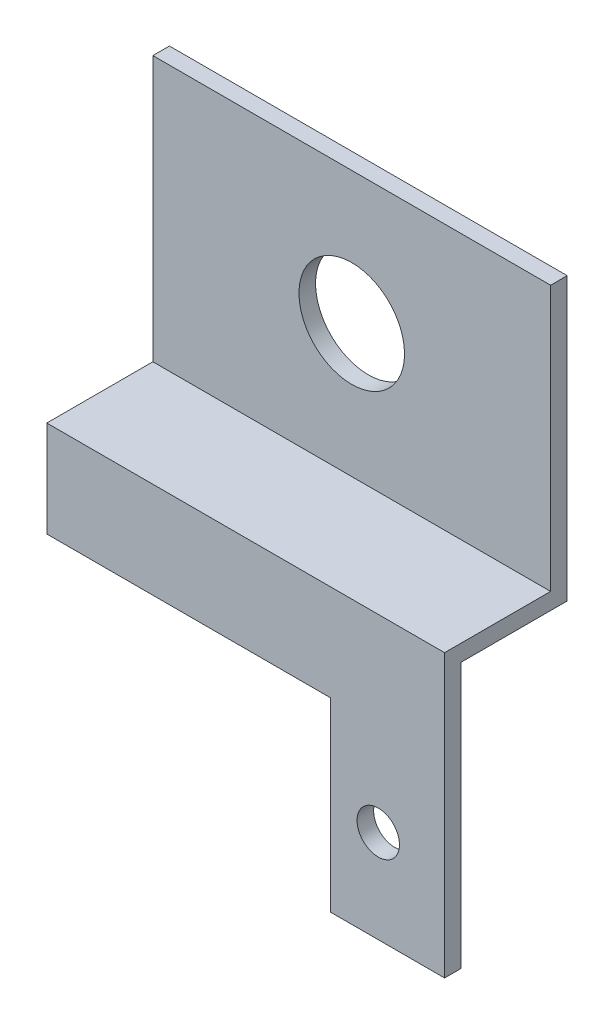
ISO-10303-21;
HEADER;
FILE_DESCRIPTION(('STEP AP214'),'2;1');
FILE_NAME('part.step','',(''),(''),'','','');
FILE_SCHEMA(('AUTOMOTIVE_DESIGN { 1 0 10303 214 1 1 1 1 }'));
ENDSEC;
DATA;
#1=APPLICATION_CONTEXT('core data for automotive mechanical design processes');
#2=APPLICATION_PROTOCOL_DEFINITION('international standard','automotive_design',2000,#1);
#3=PRODUCT_CONTEXT('',#1,'mechanical');
#4=PRODUCT('Part','Part','',(#3));
#5=PRODUCT_RELATED_PRODUCT_CATEGORY('part','',(#4));
#6=PRODUCT_DEFINITION_FORMATION('','',#4);
#7=PRODUCT_DEFINITION_CONTEXT('part definition',#1,'design');
#8=PRODUCT_DEFINITION('design','',#6,#7);
#9=PRODUCT_DEFINITION_SHAPE('','',#8);
#10=(LENGTH_UNIT() NAMED_UNIT(*) SI_UNIT(.MILLI.,.METRE.));
#11=(NAMED_UNIT(*) PLANE_ANGLE_UNIT() SI_UNIT($,.RADIAN.));
#12=(NAMED_UNIT(*) SI_UNIT($,.STERADIAN.) SOLID_ANGLE_UNIT());
#13=UNCERTAINTY_MEASURE_WITH_UNIT(LENGTH_MEASURE(1.E-05),#10,'distance_accuracy_value','');
#14=(GEOMETRIC_REPRESENTATION_CONTEXT(3) GLOBAL_UNCERTAINTY_ASSIGNED_CONTEXT((#13)) GLOBAL_UNIT_ASSIGNED_CONTEXT((#10,
#11,#12)) REPRESENTATION_CONTEXT('',''));
#15=CARTESIAN_POINT('',(0.,0.,0.));
#16=DIRECTION('',(0.,0.,1.));
#17=DIRECTION('',(1.,0.,0.));
#18=AXIS2_PLACEMENT_3D('',#15,#16,#17);
#19=CARTESIAN_POINT('',(19.05,-13.49375,14.1865840906963));
#20=DIRECTION('',(0.,1.,0.));
#21=DIRECTION('',(0.,0.,1.));
#22=AXIS2_PLACEMENT_3D('',#19,#20,#21);
#23=PLANE('',#22);
#24=DIRECTION('',(0.,0.,-1.));
#25=VECTOR('',#24,1.);
#26=CARTESIAN_POINT('',(13.589,-13.49375,14.9803340906964));
#27=LINE('',#26,#25);
#28=CARTESIAN_POINT('',(13.589,-13.49375,14.9803340906964));
#29=VERTEX_POINT('',#28);
#30=CARTESIAN_POINT('',(13.589,-13.49375,14.1865840906963));
#31=VERTEX_POINT('',#30);
#32=EDGE_CURVE('E193',#29,#31,#27,.T.);
#33=ORIENTED_EDGE('',*,*,#32,.T.);
#34=DIRECTION('',(-1.,0.,0.));
#35=VECTOR('',#34,1.);
#36=CARTESIAN_POINT('',(19.05,-13.49375,14.1865840906963));
#37=LINE('',#36,#35);
#38=CARTESIAN_POINT('',(19.05,-13.49375,14.1865840906963));
#39=VERTEX_POINT('',#38);
#40=EDGE_CURVE('E11',#39,#31,#37,.T.);
#41=ORIENTED_EDGE('',*,*,#40,.F.);
#42=DIRECTION('',(0.,0.,-1.));
#43=VECTOR('',#42,1.);
#44=CARTESIAN_POINT('',(19.05,-13.49375,14.1865840906963));
#45=LINE('',#44,#43);
#46=CARTESIAN_POINT('',(19.05,-13.49375,14.9803340906963));
#47=VERTEX_POINT('',#46);
#48=EDGE_CURVE('E146',#47,#39,#45,.T.);
#49=ORIENTED_EDGE('',*,*,#48,.F.);
#50=DIRECTION('',(-1.,0.,0.));
#51=VECTOR('',#50,1.);
#52=CARTESIAN_POINT('',(19.05,-13.49375,14.9803340906963));
#53=LINE('',#52,#51);
#54=EDGE_CURVE('E128',#47,#29,#53,.T.);
#55=ORIENTED_EDGE('',*,*,#54,.T.);
#56=EDGE_LOOP('',(#33,#41,#49,#55));
#57=FACE_BOUND('',#56,.T.);
#58=ADVANCED_FACE('F33',(#57),#23,.F.);
#59=CARTESIAN_POINT('',(19.05,-0.793750000000002,14.1865840906963));
#60=DIRECTION('',(0.,0.,1.));
#61=DIRECTION('',(0.,-1.,0.));
#62=AXIS2_PLACEMENT_3D('',#59,#60,#61);
#63=PLANE('',#62);
#64=CARTESIAN_POINT('',(15.875,-9.04875,14.1865840906963));
#65=DIRECTION('',(0.,0.,-1.));
#66=DIRECTION('',(0.,1.,0.));
#67=AXIS2_PLACEMENT_3D('',#64,#65,#66);
#68=CIRCLE('',#67,1.016);
#69=CARTESIAN_POINT('',(15.875,-8.03275,14.1865840906963));
#70=VERTEX_POINT('',#69);
#71=EDGE_CURVE('E187',#70,#70,#68,.T.);
#72=ORIENTED_EDGE('',*,*,#71,.F.);
#73=EDGE_LOOP('',(#72));
#74=FACE_BOUND('',#73,.T.);
#75=DIRECTION('',(0.,1.,0.));
#76=VECTOR('',#75,1.);
#77=CARTESIAN_POINT('',(13.589,0.,14.1865840906963));
#78=LINE('',#77,#76);
#79=CARTESIAN_POINT('',(13.589,-4.60375,14.1865840906963));
#80=VERTEX_POINT('',#79);
#81=EDGE_CURVE('E204',#31,#80,#78,.T.);
#82=ORIENTED_EDGE('',*,*,#81,.T.);
#83=DIRECTION('',(1.,0.,0.));
#84=VECTOR('',#83,1.);
#85=CARTESIAN_POINT('',(0.,-4.60375,14.1865840906963));
#86=LINE('',#85,#84);
#87=CARTESIAN_POINT('',(0.,-4.60375,14.1865840906963));
#88=VERTEX_POINT('',#87);
#89=EDGE_CURVE('E200',#88,#80,#86,.T.);
#90=ORIENTED_EDGE('',*,*,#89,.F.);
#91=DIRECTION('',(0.,1.,0.));
#92=VECTOR('',#91,1.);
#93=CARTESIAN_POINT('',(0.,-0.793750000000002,14.1865840906963));
#94=LINE('',#93,#92);
#95=CARTESIAN_POINT('',(0.,-0.793750000000002,14.1865840906963));
#96=VERTEX_POINT('',#95);
#97=EDGE_CURVE('E132',#88,#96,#94,.T.);
#98=ORIENTED_EDGE('',*,*,#97,.T.);
#99=DIRECTION('',(-1.,0.,0.));
#100=VECTOR('',#99,1.);
#101=CARTESIAN_POINT('',(19.05,-0.793750000000002,14.1865840906963));
#102=LINE('',#101,#100);
#103=CARTESIAN_POINT('',(19.05,-0.793750000000002,14.1865840906963));
#104=VERTEX_POINT('',#103);
#105=EDGE_CURVE('E40',#104,#96,#102,.T.);
#106=ORIENTED_EDGE('',*,*,#105,.F.);
#107=DIRECTION('',(0.,1.,0.));
#108=VECTOR('',#107,1.);
#109=CARTESIAN_POINT('',(19.05,-0.793750000000002,14.1865840906963));
#110=LINE('',#109,#108);
#111=EDGE_CURVE('E92',#39,#104,#110,.T.);
#112=ORIENTED_EDGE('',*,*,#111,.F.);
#113=ORIENTED_EDGE('',*,*,#40,.T.);
#114=EDGE_LOOP('',(#82,#90,#98,#106,#112,#113));
#115=FACE_BOUND('',#114,.T.);
#116=ADVANCED_FACE('F222',(#74,#115),#63,.F.);
#117=CARTESIAN_POINT('',(19.05,-13.49375,14.9803340906963));
#118=DIRECTION('',(0.,0.,-1.));
#119=DIRECTION('',(0.,1.,0.));
#120=AXIS2_PLACEMENT_3D('',#117,#118,#119);
#121=PLANE('',#120);
#122=CARTESIAN_POINT('',(15.875,-9.04875,14.9803340906964));
#123=DIRECTION('',(0.,0.,-1.));
#124=DIRECTION('',(0.,1.,0.));
#125=AXIS2_PLACEMENT_3D('',#122,#123,#124);
#126=CIRCLE('',#125,1.016);
#127=CARTESIAN_POINT('',(15.875,-8.03275,14.9803340906964));
#128=VERTEX_POINT('',#127);
#129=EDGE_CURVE('E186',#128,#128,#126,.T.);
#130=ORIENTED_EDGE('',*,*,#129,.T.);
#131=EDGE_LOOP('',(#130));
#132=FACE_BOUND('',#131,.T.);
#133=DIRECTION('',(0.,1.,0.));
#134=VECTOR('',#133,1.);
#135=CARTESIAN_POINT('',(13.589,0.,14.9803340906964));
#136=LINE('',#135,#134);
#137=CARTESIAN_POINT('',(13.589,-4.60375,14.9803340906964));
#138=VERTEX_POINT('',#137);
#139=EDGE_CURVE('E203',#29,#138,#136,.T.);
#140=ORIENTED_EDGE('',*,*,#139,.F.);
#141=ORIENTED_EDGE('',*,*,#54,.F.);
#142=DIRECTION('',(0.,-1.,0.));
#143=VECTOR('',#142,1.);
#144=CARTESIAN_POINT('',(19.05,-13.49375,14.9803340906963));
#145=LINE('',#144,#143);
#146=CARTESIAN_POINT('',(19.05,0.,14.9803340906964));
#147=VERTEX_POINT('',#146);
#148=EDGE_CURVE('E56',#147,#47,#145,.T.);
#149=ORIENTED_EDGE('',*,*,#148,.F.);
#150=DIRECTION('',(-1.,0.,0.));
#151=VECTOR('',#150,1.);
#152=CARTESIAN_POINT('',(19.05,0.,14.9803340906964));
#153=LINE('',#152,#151);
#154=CARTESIAN_POINT('',(0.,0.,14.9803340906964));
#155=VERTEX_POINT('',#154);
#156=EDGE_CURVE('E124',#147,#155,#153,.T.);
#157=ORIENTED_EDGE('',*,*,#156,.T.);
#158=DIRECTION('',(0.,-1.,0.));
#159=VECTOR('',#158,1.);
#160=CARTESIAN_POINT('',(0.,-13.49375,14.9803340906963));
#161=LINE('',#160,#159);
#162=CARTESIAN_POINT('',(0.,-4.60375000000001,14.9803340906964));
#163=VERTEX_POINT('',#162);
#164=EDGE_CURVE('E143',#155,#163,#161,.T.);
#165=ORIENTED_EDGE('',*,*,#164,.T.);
#166=DIRECTION('',(1.,0.,0.));
#167=VECTOR('',#166,1.);
#168=CARTESIAN_POINT('',(0.,-4.60375,14.9803340906964));
#169=LINE('',#168,#167);
#170=EDGE_CURVE('E47',#163,#138,#169,.T.);
#171=ORIENTED_EDGE('',*,*,#170,.T.);
#172=EDGE_LOOP('',(#140,#141,#149,#157,#165,#171));
#173=FACE_BOUND('',#172,.T.);
#174=ADVANCED_FACE('F219',(#132,#173),#121,.F.);
#175=CARTESIAN_POINT('',(19.05,-0.793750000000001,9.10658409069635));
#176=DIRECTION('',(0.,1.,0.));
#177=DIRECTION('',(0.,0.,1.));
#178=AXIS2_PLACEMENT_3D('',#175,#176,#177);
#179=PLANE('',#178);
#180=DIRECTION('',(0.,0.,-1.));
#181=VECTOR('',#180,1.);
#182=CARTESIAN_POINT('',(0.,-0.793750000000001,9.10658409069635));
#183=LINE('',#182,#181);
#184=CARTESIAN_POINT('',(0.,-0.793750000000001,9.10658409069635));
#185=VERTEX_POINT('',#184);
#186=EDGE_CURVE('E134',#96,#185,#183,.T.);
#187=ORIENTED_EDGE('',*,*,#186,.T.);
#188=DIRECTION('',(-1.,0.,0.));
#189=VECTOR('',#188,1.);
#190=CARTESIAN_POINT('',(19.05,-0.793750000000001,9.10658409069635));
#191=LINE('',#190,#189);
#192=CARTESIAN_POINT('',(19.05,-0.793750000000001,9.10658409069635));
#193=VERTEX_POINT('',#192);
#194=EDGE_CURVE('E154',#193,#185,#191,.T.);
#195=ORIENTED_EDGE('',*,*,#194,.F.);
#196=DIRECTION('',(0.,0.,-1.));
#197=VECTOR('',#196,1.);
#198=CARTESIAN_POINT('',(19.05,-0.793750000000001,9.10658409069635));
#199=LINE('',#198,#197);
#200=EDGE_CURVE('E162',#104,#193,#199,.T.);
#201=ORIENTED_EDGE('',*,*,#200,.F.);
#202=ORIENTED_EDGE('',*,*,#105,.T.);
#203=EDGE_LOOP('',(#187,#195,#201,#202));
#204=FACE_BOUND('',#203,.T.);
#205=ADVANCED_FACE('F160',(#204),#179,.F.);
#206=CARTESIAN_POINT('',(19.05,12.7,9.10658409069635));
#207=DIRECTION('',(0.,0.,1.));
#208=DIRECTION('',(0.,-1.,0.));
#209=AXIS2_PLACEMENT_3D('',#206,#207,#208);
#210=PLANE('',#209);
#211=CARTESIAN_POINT('',(9.525,6.35,9.10658409069635));
#212=DIRECTION('',(0.,0.,1.));
#213=DIRECTION('',(1.,0.,0.));
#214=AXIS2_PLACEMENT_3D('',#211,#212,#213);
#215=CIRCLE('',#214,2.5273);
#216=CARTESIAN_POINT('',(12.0523,6.35,9.10658409069635));
#217=VERTEX_POINT('',#216);
#218=EDGE_CURVE('E135',#217,#217,#215,.T.);
#219=ORIENTED_EDGE('',*,*,#218,.T.);
#220=EDGE_LOOP('',(#219));
#221=FACE_BOUND('',#220,.T.);
#222=DIRECTION('',(0.,1.,0.));
#223=VECTOR('',#222,1.);
#224=CARTESIAN_POINT('',(0.,12.7,9.10658409069635));
#225=LINE('',#224,#223);
#226=CARTESIAN_POINT('',(0.,12.7,9.10658409069635));
#227=VERTEX_POINT('',#226);
#228=EDGE_CURVE('E137',#185,#227,#225,.T.);
#229=ORIENTED_EDGE('',*,*,#228,.T.);
#230=DIRECTION('',(-1.,0.,0.));
#231=VECTOR('',#230,1.);
#232=CARTESIAN_POINT('',(19.05,12.7,9.10658409069635));
#233=LINE('',#232,#231);
#234=CARTESIAN_POINT('',(19.05,12.7,9.10658409069635));
#235=VERTEX_POINT('',#234);
#236=EDGE_CURVE('E151',#235,#227,#233,.T.);
#237=ORIENTED_EDGE('',*,*,#236,.F.);
#238=DIRECTION('',(0.,1.,0.));
#239=VECTOR('',#238,1.);
#240=CARTESIAN_POINT('',(19.05,12.7,9.10658409069635));
#241=LINE('',#240,#239);
#242=EDGE_CURVE('E175',#193,#235,#241,.T.);
#243=ORIENTED_EDGE('',*,*,#242,.F.);
#244=ORIENTED_EDGE('',*,*,#194,.T.);
#245=EDGE_LOOP('',(#229,#237,#243,#244));
#246=FACE_BOUND('',#245,.T.);
#247=ADVANCED_FACE('F171',(#221,#246),#210,.F.);
#248=CARTESIAN_POINT('',(19.05,12.7,9.90033409069635));
#249=DIRECTION('',(0.,-1.,0.));
#250=DIRECTION('',(0.,0.,-1.));
#251=AXIS2_PLACEMENT_3D('',#248,#249,#250);
#252=PLANE('',#251);
#253=DIRECTION('',(0.,0.,1.));
#254=VECTOR('',#253,1.);
#255=CARTESIAN_POINT('',(0.,12.7,9.90033409069635));
#256=LINE('',#255,#254);
#257=CARTESIAN_POINT('',(0.,12.7,9.90033409069635));
#258=VERTEX_POINT('',#257);
#259=EDGE_CURVE('E139',#227,#258,#256,.T.);
#260=ORIENTED_EDGE('',*,*,#259,.T.);
#261=DIRECTION('',(-1.,0.,0.));
#262=VECTOR('',#261,1.);
#263=CARTESIAN_POINT('',(19.05,12.7,9.90033409069635));
#264=LINE('',#263,#262);
#265=CARTESIAN_POINT('',(19.05,12.7,9.90033409069635));
#266=VERTEX_POINT('',#265);
#267=EDGE_CURVE('E123',#266,#258,#264,.T.);
#268=ORIENTED_EDGE('',*,*,#267,.F.);
#269=DIRECTION('',(0.,0.,1.));
#270=VECTOR('',#269,1.);
#271=CARTESIAN_POINT('',(19.05,12.7,9.90033409069635));
#272=LINE('',#271,#270);
#273=EDGE_CURVE('E114',#235,#266,#272,.T.);
#274=ORIENTED_EDGE('',*,*,#273,.F.);
#275=ORIENTED_EDGE('',*,*,#236,.T.);
#276=EDGE_LOOP('',(#260,#268,#274,#275));
#277=FACE_BOUND('',#276,.T.);
#278=ADVANCED_FACE('F174',(#277),#252,.F.);
#279=CARTESIAN_POINT('',(19.05,0.,9.90033409069635));
#280=DIRECTION('',(0.,0.,-1.));
#281=DIRECTION('',(-1.,0.,0.));
#282=AXIS2_PLACEMENT_3D('',#279,#280,#281);
#283=PLANE('',#282);
#284=CARTESIAN_POINT('',(9.525,6.35,9.90033409069635));
#285=DIRECTION('',(0.,0.,1.));
#286=DIRECTION('',(1.,0.,0.));
#287=AXIS2_PLACEMENT_3D('',#284,#285,#286);
#288=CIRCLE('',#287,2.5273);
#289=CARTESIAN_POINT('',(12.0523,6.35,9.90033409069635));
#290=VERTEX_POINT('',#289);
#291=EDGE_CURVE('E183',#290,#290,#288,.T.);
#292=ORIENTED_EDGE('',*,*,#291,.F.);
#293=EDGE_LOOP('',(#292));
#294=FACE_BOUND('',#293,.T.);
#295=DIRECTION('',(0.,-1.,0.));
#296=VECTOR('',#295,1.);
#297=CARTESIAN_POINT('',(0.,0.,9.90033409069635));
#298=LINE('',#297,#296);
#299=CARTESIAN_POINT('',(0.,0.,9.90033409069635));
#300=VERTEX_POINT('',#299);
#301=EDGE_CURVE('E122',#258,#300,#298,.T.);
#302=ORIENTED_EDGE('',*,*,#301,.T.);
#303=DIRECTION('',(-1.,0.,0.));
#304=VECTOR('',#303,1.);
#305=CARTESIAN_POINT('',(19.05,0.,9.90033409069635));
#306=LINE('',#305,#304);
#307=CARTESIAN_POINT('',(19.05,0.,9.90033409069635));
#308=VERTEX_POINT('',#307);
#309=EDGE_CURVE('E119',#308,#300,#306,.T.);
#310=ORIENTED_EDGE('',*,*,#309,.F.);
#311=DIRECTION('',(0.,-1.,0.));
#312=VECTOR('',#311,1.);
#313=CARTESIAN_POINT('',(19.05,0.,9.90033409069635));
#314=LINE('',#313,#312);
#315=EDGE_CURVE('E108',#266,#308,#314,.T.);
#316=ORIENTED_EDGE('',*,*,#315,.F.);
#317=ORIENTED_EDGE('',*,*,#267,.T.);
#318=EDGE_LOOP('',(#302,#310,#316,#317));
#319=FACE_BOUND('',#318,.T.);
#320=ADVANCED_FACE('F120',(#294,#319),#283,.F.);
#321=CARTESIAN_POINT('',(19.05,0.,14.9803340906964));
#322=DIRECTION('',(0.,-1.,0.));
#323=DIRECTION('',(0.,0.,-1.));
#324=AXIS2_PLACEMENT_3D('',#321,#322,#323);
#325=PLANE('',#324);
#326=DIRECTION('',(0.,0.,1.));
#327=VECTOR('',#326,1.);
#328=CARTESIAN_POINT('',(0.,0.,14.9803340906964));
#329=LINE('',#328,#327);
#330=EDGE_CURVE('E84',#300,#155,#329,.T.);
#331=ORIENTED_EDGE('',*,*,#330,.T.);
#332=ORIENTED_EDGE('',*,*,#156,.F.);
#333=DIRECTION('',(0.,0.,1.));
#334=VECTOR('',#333,1.);
#335=CARTESIAN_POINT('',(19.05,0.,14.9803340906964));
#336=LINE('',#335,#334);
#337=EDGE_CURVE('E112',#308,#147,#336,.T.);
#338=ORIENTED_EDGE('',*,*,#337,.F.);
#339=ORIENTED_EDGE('',*,*,#309,.T.);
#340=EDGE_LOOP('',(#331,#332,#338,#339));
#341=FACE_BOUND('',#340,.T.);
#342=ADVANCED_FACE('F126',(#341),#325,.F.);
#343=CARTESIAN_POINT('',(19.05,0.,0.));
#344=DIRECTION('',(-1.,0.,0.));
#345=DIRECTION('',(0.,0.,1.));
#346=AXIS2_PLACEMENT_3D('',#343,#344,#345);
#347=PLANE('',#346);
#348=ORIENTED_EDGE('',*,*,#48,.T.);
#349=ORIENTED_EDGE('',*,*,#111,.T.);
#350=ORIENTED_EDGE('',*,*,#200,.T.);
#351=ORIENTED_EDGE('',*,*,#242,.T.);
#352=ORIENTED_EDGE('',*,*,#273,.T.);
#353=ORIENTED_EDGE('',*,*,#315,.T.);
#354=ORIENTED_EDGE('',*,*,#337,.T.);
#355=ORIENTED_EDGE('',*,*,#148,.T.);
#356=EDGE_LOOP('',(#348,#349,#350,#351,#352,#353,#354,#355));
#357=FACE_BOUND('',#356,.T.);
#358=ADVANCED_FACE('F110',(#357),#347,.F.);
#359=CARTESIAN_POINT('',(0.,0.,0.));
#360=DIRECTION('',(-1.,0.,0.));
#361=DIRECTION('',(0.,0.,1.));
#362=AXIS2_PLACEMENT_3D('',#359,#360,#361);
#363=PLANE('',#362);
#364=DIRECTION('',(0.,0.,-1.));
#365=VECTOR('',#364,1.);
#366=CARTESIAN_POINT('',(0.,-4.60375,14.9803340906964));
#367=LINE('',#366,#365);
#368=EDGE_CURVE('E196',#163,#88,#367,.T.);
#369=ORIENTED_EDGE('',*,*,#368,.F.);
#370=ORIENTED_EDGE('',*,*,#164,.F.);
#371=ORIENTED_EDGE('',*,*,#330,.F.);
#372=ORIENTED_EDGE('',*,*,#301,.F.);
#373=ORIENTED_EDGE('',*,*,#259,.F.);
#374=ORIENTED_EDGE('',*,*,#228,.F.);
#375=ORIENTED_EDGE('',*,*,#186,.F.);
#376=ORIENTED_EDGE('',*,*,#97,.F.);
#377=EDGE_LOOP('',(#369,#370,#371,#372,#373,#374,#375,#376));
#378=FACE_BOUND('',#377,.T.);
#379=ADVANCED_FACE('F166',(#378),#363,.T.);
#380=CARTESIAN_POINT('',(9.525,6.35,9.90033409069635));
#381=DIRECTION('',(0.,0.,1.));
#382=DIRECTION('',(1.,0.,0.));
#383=AXIS2_PLACEMENT_3D('',#380,#381,#382);
#384=CYLINDRICAL_SURFACE('',#383,2.5273);
#385=ORIENTED_EDGE('',*,*,#218,.F.);
#386=EDGE_LOOP('',(#385));
#387=FACE_BOUND('',#386,.T.);
#388=ORIENTED_EDGE('',*,*,#291,.T.);
#389=EDGE_LOOP('',(#388));
#390=FACE_BOUND('',#389,.T.);
#391=ADVANCED_FACE('F254',(#387,#390),#384,.F.);
#392=CARTESIAN_POINT('',(15.875,-9.04875,14.9803340906964));
#393=DIRECTION('',(0.,0.,-1.));
#394=DIRECTION('',(0.,1.,0.));
#395=AXIS2_PLACEMENT_3D('',#392,#393,#394);
#396=CYLINDRICAL_SURFACE('',#395,1.016);
#397=ORIENTED_EDGE('',*,*,#129,.F.);
#398=EDGE_LOOP('',(#397));
#399=FACE_BOUND('',#398,.T.);
#400=ORIENTED_EDGE('',*,*,#71,.T.);
#401=EDGE_LOOP('',(#400));
#402=FACE_BOUND('',#401,.T.);
#403=ADVANCED_FACE('F259',(#399,#402),#396,.F.);
#404=CARTESIAN_POINT('',(13.589,0.,14.9803340906964));
#405=DIRECTION('',(-1.,0.,0.));
#406=DIRECTION('',(0.,0.,1.));
#407=AXIS2_PLACEMENT_3D('',#404,#405,#406);
#408=PLANE('',#407);
#409=ORIENTED_EDGE('',*,*,#81,.F.);
#410=ORIENTED_EDGE('',*,*,#32,.F.);
#411=ORIENTED_EDGE('',*,*,#139,.T.);
#412=DIRECTION('',(0.,0.,-1.));
#413=VECTOR('',#412,1.);
#414=CARTESIAN_POINT('',(13.589,-4.60375,14.9803340906964));
#415=LINE('',#414,#413);
#416=EDGE_CURVE('E190',#138,#80,#415,.T.);
#417=ORIENTED_EDGE('',*,*,#416,.T.);
#418=EDGE_LOOP('',(#409,#410,#411,#417));
#419=FACE_BOUND('',#418,.T.);
#420=ADVANCED_FACE('F213',(#419),#408,.T.);
#421=CARTESIAN_POINT('',(0.,-4.60375,14.9803340906964));
#422=DIRECTION('',(0.,1.,0.));
#423=DIRECTION('',(0.,0.,1.));
#424=AXIS2_PLACEMENT_3D('',#421,#422,#423);
#425=PLANE('',#424);
#426=ORIENTED_EDGE('',*,*,#89,.T.);
#427=ORIENTED_EDGE('',*,*,#416,.F.);
#428=ORIENTED_EDGE('',*,*,#170,.F.);
#429=ORIENTED_EDGE('',*,*,#368,.T.);
#430=EDGE_LOOP('',(#426,#427,#428,#429));
#431=FACE_BOUND('',#430,.T.);
#432=ADVANCED_FACE('F217',(#431),#425,.F.);
#433=CLOSED_SHELL('',(#58,#116,#174,#205,#247,#278,#320,#342,#358,#379,#391,#403,#420,#432));
#434=MANIFOLD_SOLID_BREP('B2',#433);
#435=ADVANCED_BREP_SHAPE_REPRESENTATION('',(#18,#434),#14);
#436=SHAPE_DEFINITION_REPRESENTATION(#9,#435);
ENDSEC;
END-ISO-10303-21;
